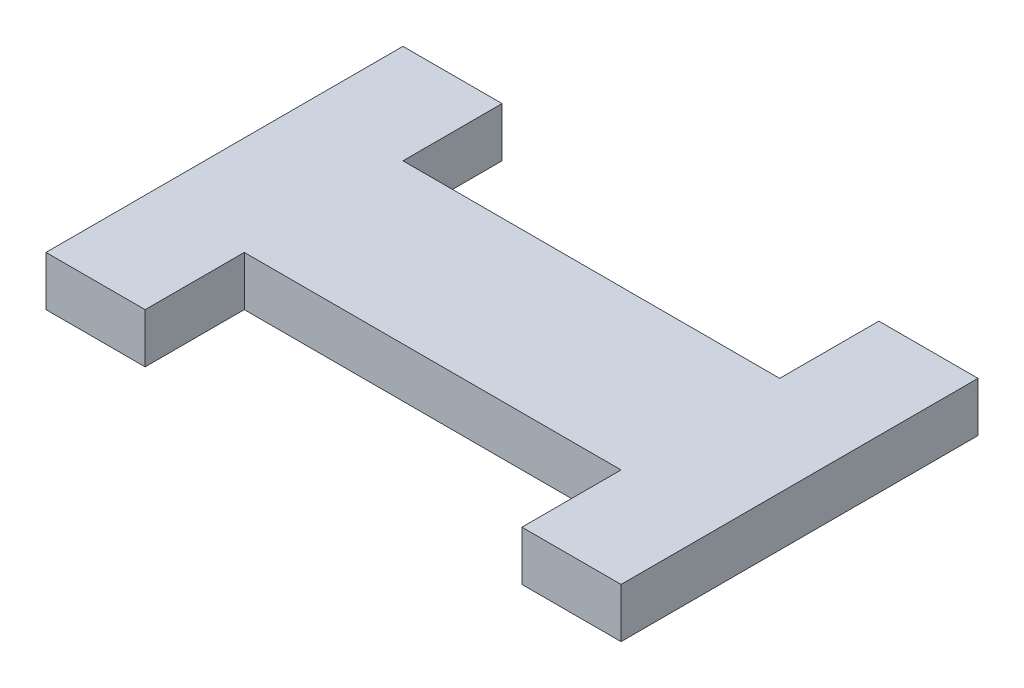
ISO-10303-21;
HEADER;
FILE_DESCRIPTION(('STEP AP214'),'2;1');
FILE_NAME('part.step','',(''),(''),'','','');
FILE_SCHEMA(('AUTOMOTIVE_DESIGN { 1 0 10303 214 1 1 1 1 }'));
ENDSEC;
DATA;
#1=APPLICATION_CONTEXT('core data for automotive mechanical design processes');
#2=APPLICATION_PROTOCOL_DEFINITION('international standard','automotive_design',2000,#1);
#3=PRODUCT_CONTEXT('',#1,'mechanical');
#4=PRODUCT('Part','Part','',(#3));
#5=PRODUCT_RELATED_PRODUCT_CATEGORY('part','',(#4));
#6=PRODUCT_DEFINITION_FORMATION('','',#4);
#7=PRODUCT_DEFINITION_CONTEXT('part definition',#1,'design');
#8=PRODUCT_DEFINITION('design','',#6,#7);
#9=PRODUCT_DEFINITION_SHAPE('','',#8);
#10=(LENGTH_UNIT() NAMED_UNIT(*) SI_UNIT(.MILLI.,.METRE.));
#11=(NAMED_UNIT(*) PLANE_ANGLE_UNIT() SI_UNIT($,.RADIAN.));
#12=(NAMED_UNIT(*) SI_UNIT($,.STERADIAN.) SOLID_ANGLE_UNIT());
#13=UNCERTAINTY_MEASURE_WITH_UNIT(LENGTH_MEASURE(1.E-05),#10,'distance_accuracy_value','');
#14=(GEOMETRIC_REPRESENTATION_CONTEXT(3) GLOBAL_UNCERTAINTY_ASSIGNED_CONTEXT((#13)) GLOBAL_UNIT_ASSIGNED_CONTEXT((#10,
#11,#12)) REPRESENTATION_CONTEXT('',''));
#15=CARTESIAN_POINT('',(0.,0.,0.));
#16=DIRECTION('',(0.,0.,1.));
#17=DIRECTION('',(1.,0.,0.));
#18=AXIS2_PLACEMENT_3D('',#15,#16,#17);
#19=CARTESIAN_POINT('',(-18.415,3.175,-11.43));
#20=DIRECTION('',(0.,0.,1.));
#21=DIRECTION('',(1.,0.,0.));
#22=AXIS2_PLACEMENT_3D('',#19,#20,#21);
#23=PLANE('',#22);
#24=DIRECTION('',(-1.,0.,0.));
#25=VECTOR('',#24,1.);
#26=CARTESIAN_POINT('',(-18.415,3.175,-11.43));
#27=LINE('',#26,#25);
#28=CARTESIAN_POINT('',(-12.065,3.175,-11.43));
#29=VERTEX_POINT('',#28);
#30=CARTESIAN_POINT('',(-18.415,3.175,-11.43));
#31=VERTEX_POINT('',#30);
#32=EDGE_CURVE('E173',#29,#31,#27,.T.);
#33=ORIENTED_EDGE('',*,*,#32,.F.);
#34=DIRECTION('',(0.,1.,0.));
#35=VECTOR('',#34,1.);
#36=CARTESIAN_POINT('',(-12.065,0.,-11.43));
#37=LINE('',#36,#35);
#38=CARTESIAN_POINT('',(-12.065,0.,-11.43));
#39=VERTEX_POINT('',#38);
#40=EDGE_CURVE('E185',#39,#29,#37,.T.);
#41=ORIENTED_EDGE('',*,*,#40,.F.);
#42=DIRECTION('',(-1.,0.,0.));
#43=VECTOR('',#42,1.);
#44=CARTESIAN_POINT('',(-18.415,0.,-11.43));
#45=LINE('',#44,#43);
#46=CARTESIAN_POINT('',(-18.415,0.,-11.43));
#47=VERTEX_POINT('',#46);
#48=EDGE_CURVE('E149',#39,#47,#45,.T.);
#49=ORIENTED_EDGE('',*,*,#48,.T.);
#50=DIRECTION('',(0.,-1.,0.));
#51=VECTOR('',#50,1.);
#52=CARTESIAN_POINT('',(-18.415,3.175,-11.43));
#53=LINE('',#52,#51);
#54=EDGE_CURVE('E48',#31,#47,#53,.T.);
#55=ORIENTED_EDGE('',*,*,#54,.F.);
#56=EDGE_LOOP('',(#33,#41,#49,#55));
#57=FACE_BOUND('',#56,.T.);
#58=ADVANCED_FACE('F40',(#57),#23,.F.);
#59=CARTESIAN_POINT('',(-18.415,3.175,11.43));
#60=DIRECTION('',(0.,0.,-1.));
#61=DIRECTION('',(-1.,0.,0.));
#62=AXIS2_PLACEMENT_3D('',#59,#60,#61);
#63=PLANE('',#62);
#64=DIRECTION('',(1.,0.,0.));
#65=VECTOR('',#64,1.);
#66=CARTESIAN_POINT('',(-18.415,3.175,11.43));
#67=LINE('',#66,#65);
#68=CARTESIAN_POINT('',(12.065,3.175,11.43));
#69=VERTEX_POINT('',#68);
#70=CARTESIAN_POINT('',(18.415,3.175,11.43));
#71=VERTEX_POINT('',#70);
#72=EDGE_CURVE('E218',#69,#71,#67,.T.);
#73=ORIENTED_EDGE('',*,*,#72,.F.);
#74=DIRECTION('',(0.,1.,0.));
#75=VECTOR('',#74,1.);
#76=CARTESIAN_POINT('',(12.065,0.,11.43));
#77=LINE('',#76,#75);
#78=CARTESIAN_POINT('',(12.065,0.,11.43));
#79=VERTEX_POINT('',#78);
#80=EDGE_CURVE('E159',#79,#69,#77,.T.);
#81=ORIENTED_EDGE('',*,*,#80,.F.);
#82=DIRECTION('',(1.,0.,0.));
#83=VECTOR('',#82,1.);
#84=CARTESIAN_POINT('',(-18.415,0.,11.43));
#85=LINE('',#84,#83);
#86=CARTESIAN_POINT('',(18.415,0.,11.43));
#87=VERTEX_POINT('',#86);
#88=EDGE_CURVE('E258',#79,#87,#85,.T.);
#89=ORIENTED_EDGE('',*,*,#88,.T.);
#90=DIRECTION('',(0.,-1.,0.));
#91=VECTOR('',#90,1.);
#92=CARTESIAN_POINT('',(18.415,3.175,11.43));
#93=LINE('',#92,#91);
#94=EDGE_CURVE('E217',#71,#87,#93,.T.);
#95=ORIENTED_EDGE('',*,*,#94,.F.);
#96=EDGE_LOOP('',(#73,#81,#89,#95));
#97=FACE_BOUND('',#96,.T.);
#98=ADVANCED_FACE('F282',(#97),#63,.F.);
#99=CARTESIAN_POINT('',(18.415,3.175,-11.43));
#100=DIRECTION('',(-1.,0.,0.));
#101=DIRECTION('',(0.,0.,1.));
#102=AXIS2_PLACEMENT_3D('',#99,#100,#101);
#103=PLANE('',#102);
#104=DIRECTION('',(0.,0.,-1.));
#105=VECTOR('',#104,1.);
#106=CARTESIAN_POINT('',(18.415,0.,-11.43));
#107=LINE('',#106,#105);
#108=CARTESIAN_POINT('',(18.415,0.,-11.43));
#109=VERTEX_POINT('',#108);
#110=EDGE_CURVE('E187',#87,#109,#107,.T.);
#111=ORIENTED_EDGE('',*,*,#110,.T.);
#112=DIRECTION('',(0.,-1.,0.));
#113=VECTOR('',#112,1.);
#114=CARTESIAN_POINT('',(18.415,3.175,-11.43));
#115=LINE('',#114,#113);
#116=CARTESIAN_POINT('',(18.415,3.175,-11.43));
#117=VERTEX_POINT('',#116);
#118=EDGE_CURVE('E12',#117,#109,#115,.T.);
#119=ORIENTED_EDGE('',*,*,#118,.F.);
#120=DIRECTION('',(0.,0.,-1.));
#121=VECTOR('',#120,1.);
#122=CARTESIAN_POINT('',(18.415,3.175,-11.43));
#123=LINE('',#122,#121);
#124=EDGE_CURVE('E174',#71,#117,#123,.T.);
#125=ORIENTED_EDGE('',*,*,#124,.F.);
#126=ORIENTED_EDGE('',*,*,#94,.T.);
#127=EDGE_LOOP('',(#111,#119,#125,#126));
#128=FACE_BOUND('',#127,.T.);
#129=ADVANCED_FACE('F42',(#128),#103,.F.);
#130=CARTESIAN_POINT('',(12.065,0.,-11.43));
#131=VERTEX_POINT('',#130);
#132=EDGE_CURVE('E253',#109,#131,#45,.T.);
#133=ORIENTED_EDGE('',*,*,#132,.T.);
#134=DIRECTION('',(0.,1.,0.));
#135=VECTOR('',#134,1.);
#136=CARTESIAN_POINT('',(12.065,0.,-11.43));
#137=LINE('',#136,#135);
#138=CARTESIAN_POINT('',(12.065,3.175,-11.43));
#139=VERTEX_POINT('',#138);
#140=EDGE_CURVE('E188',#131,#139,#137,.T.);
#141=ORIENTED_EDGE('',*,*,#140,.T.);
#142=EDGE_CURVE('E167',#117,#139,#27,.T.);
#143=ORIENTED_EDGE('',*,*,#142,.F.);
#144=ORIENTED_EDGE('',*,*,#118,.T.);
#145=EDGE_LOOP('',(#133,#141,#143,#144));
#146=FACE_BOUND('',#145,.T.);
#147=ADVANCED_FACE('F252',(#146),#23,.F.);
#148=CARTESIAN_POINT('',(-18.415,3.175,-11.43));
#149=DIRECTION('',(1.,0.,0.));
#150=DIRECTION('',(0.,0.,-1.));
#151=AXIS2_PLACEMENT_3D('',#148,#149,#150);
#152=PLANE('',#151);
#153=DIRECTION('',(0.,0.,1.));
#154=VECTOR('',#153,1.);
#155=CARTESIAN_POINT('',(-18.415,0.,-11.43));
#156=LINE('',#155,#154);
#157=CARTESIAN_POINT('',(-18.415,0.,11.43));
#158=VERTEX_POINT('',#157);
#159=EDGE_CURVE('E257',#47,#158,#156,.T.);
#160=ORIENTED_EDGE('',*,*,#159,.T.);
#161=DIRECTION('',(0.,-1.,0.));
#162=VECTOR('',#161,1.);
#163=CARTESIAN_POINT('',(-18.415,3.175,11.43));
#164=LINE('',#163,#162);
#165=CARTESIAN_POINT('',(-18.415,3.175,11.43));
#166=VERTEX_POINT('',#165);
#167=EDGE_CURVE('E265',#166,#158,#164,.T.);
#168=ORIENTED_EDGE('',*,*,#167,.F.);
#169=DIRECTION('',(0.,0.,1.));
#170=VECTOR('',#169,1.);
#171=CARTESIAN_POINT('',(-18.415,3.175,-11.43));
#172=LINE('',#171,#170);
#173=EDGE_CURVE('E172',#31,#166,#172,.T.);
#174=ORIENTED_EDGE('',*,*,#173,.F.);
#175=ORIENTED_EDGE('',*,*,#54,.T.);
#176=EDGE_LOOP('',(#160,#168,#174,#175));
#177=FACE_BOUND('',#176,.T.);
#178=ADVANCED_FACE('F271',(#177),#152,.F.);
#179=CARTESIAN_POINT('',(-12.065,0.,11.43));
#180=VERTEX_POINT('',#179);
#181=EDGE_CURVE('E246',#158,#180,#85,.T.);
#182=ORIENTED_EDGE('',*,*,#181,.T.);
#183=DIRECTION('',(0.,1.,0.));
#184=VECTOR('',#183,1.);
#185=CARTESIAN_POINT('',(-12.065,0.,11.43));
#186=LINE('',#185,#184);
#187=CARTESIAN_POINT('',(-12.065,3.175,11.43));
#188=VERTEX_POINT('',#187);
#189=EDGE_CURVE('E225',#180,#188,#186,.T.);
#190=ORIENTED_EDGE('',*,*,#189,.T.);
#191=EDGE_CURVE('E212',#166,#188,#67,.T.);
#192=ORIENTED_EDGE('',*,*,#191,.F.);
#193=ORIENTED_EDGE('',*,*,#167,.T.);
#194=EDGE_LOOP('',(#182,#190,#192,#193));
#195=FACE_BOUND('',#194,.T.);
#196=ADVANCED_FACE('F277',(#195),#63,.F.);
#197=CARTESIAN_POINT('',(0.,3.175,0.));
#198=DIRECTION('',(0.,1.,0.));
#199=DIRECTION('',(0.,0.,1.));
#200=AXIS2_PLACEMENT_3D('',#197,#198,#199);
#201=PLANE('',#200);
#202=DIRECTION('',(0.,0.,1.));
#203=VECTOR('',#202,1.);
#204=CARTESIAN_POINT('',(-12.065,3.175,-11.43));
#205=LINE('',#204,#203);
#206=CARTESIAN_POINT('',(-12.065,3.175,-5.07999999999997));
#207=VERTEX_POINT('',#206);
#208=EDGE_CURVE('E135',#29,#207,#205,.T.);
#209=ORIENTED_EDGE('',*,*,#208,.F.);
#210=ORIENTED_EDGE('',*,*,#32,.T.);
#211=ORIENTED_EDGE('',*,*,#173,.T.);
#212=ORIENTED_EDGE('',*,*,#191,.T.);
#213=DIRECTION('',(0.,0.,1.));
#214=VECTOR('',#213,1.);
#215=CARTESIAN_POINT('',(-12.065,3.175,11.43));
#216=LINE('',#215,#214);
#217=CARTESIAN_POINT('',(-12.065,3.175,5.08000000000001));
#218=VERTEX_POINT('',#217);
#219=EDGE_CURVE('E196',#218,#188,#216,.T.);
#220=ORIENTED_EDGE('',*,*,#219,.F.);
#221=DIRECTION('',(-1.,0.,0.));
#222=VECTOR('',#221,1.);
#223=CARTESIAN_POINT('',(12.065,3.175,5.08));
#224=LINE('',#223,#222);
#225=CARTESIAN_POINT('',(12.065,3.175,5.08));
#226=VERTEX_POINT('',#225);
#227=EDGE_CURVE('E206',#226,#218,#224,.T.);
#228=ORIENTED_EDGE('',*,*,#227,.F.);
#229=DIRECTION('',(0.,0.,-1.));
#230=VECTOR('',#229,1.);
#231=CARTESIAN_POINT('',(12.065,3.175,11.43));
#232=LINE('',#231,#230);
#233=EDGE_CURVE('E201',#69,#226,#232,.T.);
#234=ORIENTED_EDGE('',*,*,#233,.F.);
#235=ORIENTED_EDGE('',*,*,#72,.T.);
#236=ORIENTED_EDGE('',*,*,#124,.T.);
#237=ORIENTED_EDGE('',*,*,#142,.T.);
#238=DIRECTION('',(0.,0.,-1.));
#239=VECTOR('',#238,1.);
#240=CARTESIAN_POINT('',(12.065,3.175,-11.43));
#241=LINE('',#240,#239);
#242=CARTESIAN_POINT('',(12.065,3.175,-5.07999999999997));
#243=VERTEX_POINT('',#242);
#244=EDGE_CURVE('E150',#243,#139,#241,.T.);
#245=ORIENTED_EDGE('',*,*,#244,.F.);
#246=DIRECTION('',(1.,0.,0.));
#247=VECTOR('',#246,1.);
#248=CARTESIAN_POINT('',(-12.065,3.175,-5.07999999999997));
#249=LINE('',#248,#247);
#250=EDGE_CURVE('E153',#207,#243,#249,.T.);
#251=ORIENTED_EDGE('',*,*,#250,.F.);
#252=EDGE_LOOP('',(#209,#210,#211,#212,#220,#228,#234,#235,#236,#237,#245,#251));
#253=FACE_BOUND('',#252,.T.);
#254=ADVANCED_FACE('F241',(#253),#201,.T.);
#255=CARTESIAN_POINT('',(0.,0.,0.));
#256=DIRECTION('',(0.,1.,0.));
#257=DIRECTION('',(0.,0.,1.));
#258=AXIS2_PLACEMENT_3D('',#255,#256,#257);
#259=PLANE('',#258);
#260=ORIENTED_EDGE('',*,*,#48,.F.);
#261=DIRECTION('',(0.,0.,1.));
#262=VECTOR('',#261,1.);
#263=CARTESIAN_POINT('',(-12.065,0.,-11.43));
#264=LINE('',#263,#262);
#265=CARTESIAN_POINT('',(-12.065,0.,-5.07999999999997));
#266=VERTEX_POINT('',#265);
#267=EDGE_CURVE('E132',#39,#266,#264,.T.);
#268=ORIENTED_EDGE('',*,*,#267,.T.);
#269=DIRECTION('',(1.,0.,0.));
#270=VECTOR('',#269,1.);
#271=CARTESIAN_POINT('',(-12.065,0.,-5.07999999999997));
#272=LINE('',#271,#270);
#273=CARTESIAN_POINT('',(12.065,0.,-5.07999999999997));
#274=VERTEX_POINT('',#273);
#275=EDGE_CURVE('E142',#266,#274,#272,.T.);
#276=ORIENTED_EDGE('',*,*,#275,.T.);
#277=DIRECTION('',(0.,0.,-1.));
#278=VECTOR('',#277,1.);
#279=CARTESIAN_POINT('',(12.065,0.,-11.43));
#280=LINE('',#279,#278);
#281=EDGE_CURVE('E55',#274,#131,#280,.T.);
#282=ORIENTED_EDGE('',*,*,#281,.T.);
#283=ORIENTED_EDGE('',*,*,#132,.F.);
#284=ORIENTED_EDGE('',*,*,#110,.F.);
#285=ORIENTED_EDGE('',*,*,#88,.F.);
#286=DIRECTION('',(0.,0.,-1.));
#287=VECTOR('',#286,1.);
#288=CARTESIAN_POINT('',(12.065,0.,11.43));
#289=LINE('',#288,#287);
#290=CARTESIAN_POINT('',(12.065,0.,5.08));
#291=VERTEX_POINT('',#290);
#292=EDGE_CURVE('E192',#79,#291,#289,.T.);
#293=ORIENTED_EDGE('',*,*,#292,.T.);
#294=DIRECTION('',(-1.,0.,0.));
#295=VECTOR('',#294,1.);
#296=CARTESIAN_POINT('',(12.065,0.,5.08));
#297=LINE('',#296,#295);
#298=CARTESIAN_POINT('',(-12.065,0.,5.08000000000001));
#299=VERTEX_POINT('',#298);
#300=EDGE_CURVE('E195',#291,#299,#297,.T.);
#301=ORIENTED_EDGE('',*,*,#300,.T.);
#302=DIRECTION('',(0.,0.,1.));
#303=VECTOR('',#302,1.);
#304=CARTESIAN_POINT('',(-12.065,0.,11.43));
#305=LINE('',#304,#303);
#306=EDGE_CURVE('E63',#299,#180,#305,.T.);
#307=ORIENTED_EDGE('',*,*,#306,.T.);
#308=ORIENTED_EDGE('',*,*,#181,.F.);
#309=ORIENTED_EDGE('',*,*,#159,.F.);
#310=EDGE_LOOP('',(#260,#268,#276,#282,#283,#284,#285,#293,#301,#307,#308,#309));
#311=FACE_BOUND('',#310,.T.);
#312=ADVANCED_FACE('F147',(#311),#259,.F.);
#313=CARTESIAN_POINT('',(12.065,0.,11.43));
#314=DIRECTION('',(1.,0.,0.));
#315=DIRECTION('',(0.,0.,-1.));
#316=AXIS2_PLACEMENT_3D('',#313,#314,#315);
#317=PLANE('',#316);
#318=ORIENTED_EDGE('',*,*,#233,.T.);
#319=DIRECTION('',(0.,1.,0.));
#320=VECTOR('',#319,1.);
#321=CARTESIAN_POINT('',(12.065,0.,5.08));
#322=LINE('',#321,#320);
#323=EDGE_CURVE('E200',#291,#226,#322,.T.);
#324=ORIENTED_EDGE('',*,*,#323,.F.);
#325=ORIENTED_EDGE('',*,*,#292,.F.);
#326=ORIENTED_EDGE('',*,*,#80,.T.);
#327=EDGE_LOOP('',(#318,#324,#325,#326));
#328=FACE_BOUND('',#327,.T.);
#329=ADVANCED_FACE('F237',(#328),#317,.F.);
#330=CARTESIAN_POINT('',(-12.065,0.,11.43));
#331=DIRECTION('',(-1.,0.,0.));
#332=DIRECTION('',(0.,0.,1.));
#333=AXIS2_PLACEMENT_3D('',#330,#331,#332);
#334=PLANE('',#333);
#335=ORIENTED_EDGE('',*,*,#219,.T.);
#336=ORIENTED_EDGE('',*,*,#189,.F.);
#337=ORIENTED_EDGE('',*,*,#306,.F.);
#338=DIRECTION('',(0.,1.,0.));
#339=VECTOR('',#338,1.);
#340=CARTESIAN_POINT('',(-12.065,0.,5.08000000000001));
#341=LINE('',#340,#339);
#342=EDGE_CURVE('E228',#299,#218,#341,.T.);
#343=ORIENTED_EDGE('',*,*,#342,.T.);
#344=EDGE_LOOP('',(#335,#336,#337,#343));
#345=FACE_BOUND('',#344,.T.);
#346=ADVANCED_FACE('F344',(#345),#334,.F.);
#347=CARTESIAN_POINT('',(12.065,0.,5.08));
#348=DIRECTION('',(0.,0.,-1.));
#349=DIRECTION('',(-1.,0.,0.));
#350=AXIS2_PLACEMENT_3D('',#347,#348,#349);
#351=PLANE('',#350);
#352=ORIENTED_EDGE('',*,*,#227,.T.);
#353=ORIENTED_EDGE('',*,*,#342,.F.);
#354=ORIENTED_EDGE('',*,*,#300,.F.);
#355=ORIENTED_EDGE('',*,*,#323,.T.);
#356=EDGE_LOOP('',(#352,#353,#354,#355));
#357=FACE_BOUND('',#356,.T.);
#358=ADVANCED_FACE('F232',(#357),#351,.F.);
#359=CARTESIAN_POINT('',(-12.065,0.,-11.43));
#360=DIRECTION('',(-1.,0.,0.));
#361=DIRECTION('',(0.,0.,1.));
#362=AXIS2_PLACEMENT_3D('',#359,#360,#361);
#363=PLANE('',#362);
#364=ORIENTED_EDGE('',*,*,#208,.T.);
#365=DIRECTION('',(0.,1.,0.));
#366=VECTOR('',#365,1.);
#367=CARTESIAN_POINT('',(-12.065,0.,-5.07999999999997));
#368=LINE('',#367,#366);
#369=EDGE_CURVE('E128',#266,#207,#368,.T.);
#370=ORIENTED_EDGE('',*,*,#369,.F.);
#371=ORIENTED_EDGE('',*,*,#267,.F.);
#372=ORIENTED_EDGE('',*,*,#40,.T.);
#373=EDGE_LOOP('',(#364,#370,#371,#372));
#374=FACE_BOUND('',#373,.T.);
#375=ADVANCED_FACE('F130',(#374),#363,.F.);
#376=CARTESIAN_POINT('',(12.065,0.,-11.43));
#377=DIRECTION('',(1.,0.,0.));
#378=DIRECTION('',(0.,0.,-1.));
#379=AXIS2_PLACEMENT_3D('',#376,#377,#378);
#380=PLANE('',#379);
#381=ORIENTED_EDGE('',*,*,#244,.T.);
#382=ORIENTED_EDGE('',*,*,#140,.F.);
#383=ORIENTED_EDGE('',*,*,#281,.F.);
#384=DIRECTION('',(0.,1.,0.));
#385=VECTOR('',#384,1.);
#386=CARTESIAN_POINT('',(12.065,0.,-5.07999999999997));
#387=LINE('',#386,#385);
#388=EDGE_CURVE('E139',#274,#243,#387,.T.);
#389=ORIENTED_EDGE('',*,*,#388,.T.);
#390=EDGE_LOOP('',(#381,#382,#383,#389));
#391=FACE_BOUND('',#390,.T.);
#392=ADVANCED_FACE('F249',(#391),#380,.F.);
#393=CARTESIAN_POINT('',(-12.065,0.,-5.07999999999997));
#394=DIRECTION('',(0.,0.,1.));
#395=DIRECTION('',(1.,0.,0.));
#396=AXIS2_PLACEMENT_3D('',#393,#394,#395);
#397=PLANE('',#396);
#398=ORIENTED_EDGE('',*,*,#250,.T.);
#399=ORIENTED_EDGE('',*,*,#388,.F.);
#400=ORIENTED_EDGE('',*,*,#275,.F.);
#401=ORIENTED_EDGE('',*,*,#369,.T.);
#402=EDGE_LOOP('',(#398,#399,#400,#401));
#403=FACE_BOUND('',#402,.T.);
#404=ADVANCED_FACE('F143',(#403),#397,.F.);
#405=CLOSED_SHELL('',(#58,#98,#129,#147,#178,#196,#254,#312,#329,#346,#358,#375,#392,#404));
#406=MANIFOLD_SOLID_BREP('B2',#405);
#407=ADVANCED_BREP_SHAPE_REPRESENTATION('',(#18,#406),#14);
#408=SHAPE_DEFINITION_REPRESENTATION(#9,#407);
ENDSEC;
END-ISO-10303-21;
